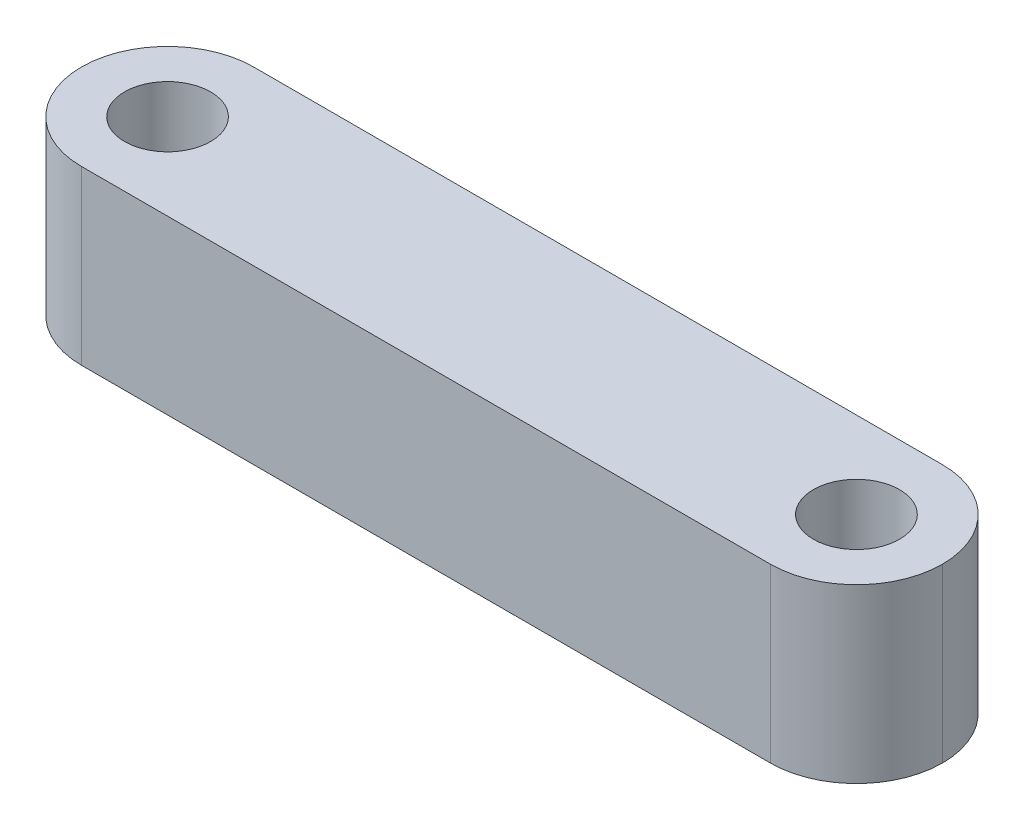
ISO-10303-21;
HEADER;
FILE_DESCRIPTION(('STEP AP214'),'2;1');
FILE_NAME('part.step','',(''),(''),'','','');
FILE_SCHEMA(('AUTOMOTIVE_DESIGN { 1 0 10303 214 1 1 1 1 }'));
ENDSEC;
DATA;
#1=APPLICATION_CONTEXT('core data for automotive mechanical design processes');
#2=APPLICATION_PROTOCOL_DEFINITION('international standard','automotive_design',2000,#1);
#3=PRODUCT_CONTEXT('',#1,'mechanical');
#4=PRODUCT('Part','Part','',(#3));
#5=PRODUCT_RELATED_PRODUCT_CATEGORY('part','',(#4));
#6=PRODUCT_DEFINITION_FORMATION('','',#4);
#7=PRODUCT_DEFINITION_CONTEXT('part definition',#1,'design');
#8=PRODUCT_DEFINITION('design','',#6,#7);
#9=PRODUCT_DEFINITION_SHAPE('','',#8);
#10=(LENGTH_UNIT() NAMED_UNIT(*) SI_UNIT(.MILLI.,.METRE.));
#11=(NAMED_UNIT(*) PLANE_ANGLE_UNIT() SI_UNIT($,.RADIAN.));
#12=(NAMED_UNIT(*) SI_UNIT($,.STERADIAN.) SOLID_ANGLE_UNIT());
#13=UNCERTAINTY_MEASURE_WITH_UNIT(LENGTH_MEASURE(1.E-05),#10,'distance_accuracy_value','');
#14=(GEOMETRIC_REPRESENTATION_CONTEXT(3) GLOBAL_UNCERTAINTY_ASSIGNED_CONTEXT((#13)) GLOBAL_UNIT_ASSIGNED_CONTEXT((#10,
#11,#12)) REPRESENTATION_CONTEXT('',''));
#15=CARTESIAN_POINT('',(0.,0.,0.));
#16=DIRECTION('',(0.,0.,1.));
#17=DIRECTION('',(1.,0.,0.));
#18=AXIS2_PLACEMENT_3D('',#15,#16,#17);
#19=CARTESIAN_POINT('',(-12.5,5.,-2.5));
#20=DIRECTION('',(0.,0.,1.));
#21=DIRECTION('',(1.,0.,0.));
#22=AXIS2_PLACEMENT_3D('',#19,#20,#21);
#23=PLANE('',#22);
#24=DIRECTION('',(-1.,0.,0.));
#25=VECTOR('',#24,1.);
#26=CARTESIAN_POINT('',(-12.5,5.,-2.5));
#27=LINE('',#26,#25);
#28=CARTESIAN_POINT('',(10.,5.,-2.5));
#29=VERTEX_POINT('',#28);
#30=CARTESIAN_POINT('',(-10.,5.,-2.5));
#31=VERTEX_POINT('',#30);
#32=EDGE_CURVE('E132',#29,#31,#27,.T.);
#33=ORIENTED_EDGE('',*,*,#32,.F.);
#34=DIRECTION('',(0.,-1.,0.));
#35=VECTOR('',#34,1.);
#36=CARTESIAN_POINT('',(10.,5.,-2.5));
#37=LINE('',#36,#35);
#38=CARTESIAN_POINT('',(10.,0.,-2.5));
#39=VERTEX_POINT('',#38);
#40=EDGE_CURVE('E11',#29,#39,#37,.T.);
#41=ORIENTED_EDGE('',*,*,#40,.T.);
#42=DIRECTION('',(-1.,0.,0.));
#43=VECTOR('',#42,1.);
#44=CARTESIAN_POINT('',(-12.5,0.,-2.5));
#45=LINE('',#44,#43);
#46=CARTESIAN_POINT('',(-10.,0.,-2.5));
#47=VERTEX_POINT('',#46);
#48=EDGE_CURVE('E95',#39,#47,#45,.T.);
#49=ORIENTED_EDGE('',*,*,#48,.T.);
#50=DIRECTION('',(0.,-1.,0.));
#51=VECTOR('',#50,1.);
#52=CARTESIAN_POINT('',(-10.,5.,-2.5));
#53=LINE('',#52,#51);
#54=EDGE_CURVE('E42',#47,#31,#53,.F.);
#55=ORIENTED_EDGE('',*,*,#54,.T.);
#56=EDGE_LOOP('',(#33,#41,#49,#55));
#57=FACE_BOUND('',#56,.T.);
#58=ADVANCED_FACE('F33',(#57),#23,.F.);
#59=CARTESIAN_POINT('',(-12.5,5.,2.5));
#60=DIRECTION('',(0.,0.,-1.));
#61=DIRECTION('',(-1.,0.,0.));
#62=AXIS2_PLACEMENT_3D('',#59,#60,#61);
#63=PLANE('',#62);
#64=DIRECTION('',(1.,0.,0.));
#65=VECTOR('',#64,1.);
#66=CARTESIAN_POINT('',(-12.5,0.,2.5));
#67=LINE('',#66,#65);
#68=CARTESIAN_POINT('',(-10.,0.,2.5));
#69=VERTEX_POINT('',#68);
#70=CARTESIAN_POINT('',(10.,0.,2.5));
#71=VERTEX_POINT('',#70);
#72=EDGE_CURVE('E131',#69,#71,#67,.T.);
#73=ORIENTED_EDGE('',*,*,#72,.T.);
#74=DIRECTION('',(0.,-1.,0.));
#75=VECTOR('',#74,1.);
#76=CARTESIAN_POINT('',(10.,5.,2.5));
#77=LINE('',#76,#75);
#78=CARTESIAN_POINT('',(10.,5.,2.5));
#79=VERTEX_POINT('',#78);
#80=EDGE_CURVE('E110',#71,#79,#77,.F.);
#81=ORIENTED_EDGE('',*,*,#80,.T.);
#82=DIRECTION('',(1.,0.,0.));
#83=VECTOR('',#82,1.);
#84=CARTESIAN_POINT('',(-12.5,5.,2.5));
#85=LINE('',#84,#83);
#86=CARTESIAN_POINT('',(-10.,5.,2.5));
#87=VERTEX_POINT('',#86);
#88=EDGE_CURVE('E127',#87,#79,#85,.T.);
#89=ORIENTED_EDGE('',*,*,#88,.F.);
#90=DIRECTION('',(0.,-1.,0.));
#91=VECTOR('',#90,1.);
#92=CARTESIAN_POINT('',(-10.,5.,2.5));
#93=LINE('',#92,#91);
#94=EDGE_CURVE('E111',#87,#69,#93,.T.);
#95=ORIENTED_EDGE('',*,*,#94,.T.);
#96=EDGE_LOOP('',(#73,#81,#89,#95));
#97=FACE_BOUND('',#96,.T.);
#98=ADVANCED_FACE('F129',(#97),#63,.F.);
#99=CARTESIAN_POINT('',(0.,5.,0.));
#100=DIRECTION('',(0.,-1.,0.));
#101=DIRECTION('',(0.,0.,-1.));
#102=AXIS2_PLACEMENT_3D('',#99,#100,#101);
#103=PLANE('',#102);
#104=CARTESIAN_POINT('',(-10.,5.,0.));
#105=DIRECTION('',(0.,1.,0.));
#106=DIRECTION('',(0.,0.,1.));
#107=AXIS2_PLACEMENT_3D('',#104,#105,#106);
#108=CIRCLE('',#107,1.25);
#109=CARTESIAN_POINT('',(-10.,5.,1.25));
#110=VERTEX_POINT('',#109);
#111=EDGE_CURVE('E187',#110,#110,#108,.T.);
#112=ORIENTED_EDGE('',*,*,#111,.F.);
#113=EDGE_LOOP('',(#112));
#114=FACE_BOUND('',#113,.T.);
#115=CARTESIAN_POINT('',(10.,5.,0.));
#116=DIRECTION('',(0.,1.,0.));
#117=DIRECTION('',(0.,0.,1.));
#118=AXIS2_PLACEMENT_3D('',#115,#116,#117);
#119=CIRCLE('',#118,1.25);
#120=CARTESIAN_POINT('',(10.,5.,1.25));
#121=VERTEX_POINT('',#120);
#122=EDGE_CURVE('E106',#121,#121,#119,.T.);
#123=ORIENTED_EDGE('',*,*,#122,.F.);
#124=EDGE_LOOP('',(#123));
#125=FACE_BOUND('',#124,.T.);
#126=ORIENTED_EDGE('',*,*,#88,.T.);
#127=CARTESIAN_POINT('',(10.,5.,0.));
#128=DIRECTION('',(0.,-1.,0.));
#129=DIRECTION('',(0.,0.,-1.));
#130=AXIS2_PLACEMENT_3D('',#127,#128,#129);
#131=CIRCLE('',#130,2.5);
#132=CARTESIAN_POINT('',(12.5,5.,0.));
#133=VERTEX_POINT('',#132);
#134=EDGE_CURVE('E122',#79,#133,#131,.F.);
#135=ORIENTED_EDGE('',*,*,#134,.T.);
#136=CARTESIAN_POINT('',(10.,5.,0.));
#137=DIRECTION('',(0.,-1.,0.));
#138=DIRECTION('',(0.,0.,-1.));
#139=AXIS2_PLACEMENT_3D('',#136,#137,#138);
#140=CIRCLE('',#139,2.5);
#141=EDGE_CURVE('E104',#133,#29,#140,.F.);
#142=ORIENTED_EDGE('',*,*,#141,.T.);
#143=ORIENTED_EDGE('',*,*,#32,.T.);
#144=CARTESIAN_POINT('',(-10.,5.,0.));
#145=DIRECTION('',(0.,-1.,0.));
#146=DIRECTION('',(0.,0.,-1.));
#147=AXIS2_PLACEMENT_3D('',#144,#145,#146);
#148=CIRCLE('',#147,2.5);
#149=CARTESIAN_POINT('',(-12.5,5.,0.));
#150=VERTEX_POINT('',#149);
#151=EDGE_CURVE('E50',#31,#150,#148,.F.);
#152=ORIENTED_EDGE('',*,*,#151,.T.);
#153=CARTESIAN_POINT('',(-10.,5.,0.));
#154=DIRECTION('',(0.,-1.,0.));
#155=DIRECTION('',(0.,0.,-1.));
#156=AXIS2_PLACEMENT_3D('',#153,#154,#155);
#157=CIRCLE('',#156,2.5);
#158=EDGE_CURVE('E119',#150,#87,#157,.F.);
#159=ORIENTED_EDGE('',*,*,#158,.T.);
#160=EDGE_LOOP('',(#126,#135,#142,#143,#152,#159));
#161=FACE_BOUND('',#160,.T.);
#162=ADVANCED_FACE('F125',(#114,#125,#161),#103,.F.);
#163=CARTESIAN_POINT('',(0.,0.,0.));
#164=DIRECTION('',(0.,-1.,0.));
#165=DIRECTION('',(0.,0.,-1.));
#166=AXIS2_PLACEMENT_3D('',#163,#164,#165);
#167=PLANE('',#166);
#168=CARTESIAN_POINT('',(-10.,0.,0.));
#169=DIRECTION('',(0.,1.,0.));
#170=DIRECTION('',(0.,0.,1.));
#171=AXIS2_PLACEMENT_3D('',#168,#169,#170);
#172=CIRCLE('',#171,1.25);
#173=CARTESIAN_POINT('',(-10.,0.,1.25));
#174=VERTEX_POINT('',#173);
#175=EDGE_CURVE('E135',#174,#174,#172,.T.);
#176=ORIENTED_EDGE('',*,*,#175,.T.);
#177=EDGE_LOOP('',(#176));
#178=FACE_BOUND('',#177,.T.);
#179=CARTESIAN_POINT('',(10.,0.,0.));
#180=DIRECTION('',(0.,1.,0.));
#181=DIRECTION('',(0.,0.,1.));
#182=AXIS2_PLACEMENT_3D('',#179,#180,#181);
#183=CIRCLE('',#182,1.25);
#184=CARTESIAN_POINT('',(10.,0.,1.25));
#185=VERTEX_POINT('',#184);
#186=EDGE_CURVE('E186',#185,#185,#183,.T.);
#187=ORIENTED_EDGE('',*,*,#186,.T.);
#188=EDGE_LOOP('',(#187));
#189=FACE_BOUND('',#188,.T.);
#190=CARTESIAN_POINT('',(10.,0.,0.));
#191=DIRECTION('',(0.,-1.,0.));
#192=DIRECTION('',(0.,0.,-1.));
#193=AXIS2_PLACEMENT_3D('',#190,#191,#192);
#194=CIRCLE('',#193,2.5);
#195=CARTESIAN_POINT('',(12.5,0.,0.));
#196=VERTEX_POINT('',#195);
#197=EDGE_CURVE('E88',#39,#196,#194,.T.);
#198=ORIENTED_EDGE('',*,*,#197,.T.);
#199=CARTESIAN_POINT('',(10.,0.,0.));
#200=DIRECTION('',(0.,-1.,0.));
#201=DIRECTION('',(0.,0.,-1.));
#202=AXIS2_PLACEMENT_3D('',#199,#200,#201);
#203=CIRCLE('',#202,2.5);
#204=EDGE_CURVE('E93',#196,#71,#203,.T.);
#205=ORIENTED_EDGE('',*,*,#204,.T.);
#206=ORIENTED_EDGE('',*,*,#72,.F.);
#207=CARTESIAN_POINT('',(-10.,0.,0.));
#208=DIRECTION('',(0.,-1.,0.));
#209=DIRECTION('',(0.,0.,-1.));
#210=AXIS2_PLACEMENT_3D('',#207,#208,#209);
#211=CIRCLE('',#210,2.5);
#212=CARTESIAN_POINT('',(-12.5,0.,0.));
#213=VERTEX_POINT('',#212);
#214=EDGE_CURVE('E98',#69,#213,#211,.T.);
#215=ORIENTED_EDGE('',*,*,#214,.T.);
#216=CARTESIAN_POINT('',(-10.,0.,0.));
#217=DIRECTION('',(0.,-1.,0.));
#218=DIRECTION('',(0.,0.,-1.));
#219=AXIS2_PLACEMENT_3D('',#216,#217,#218);
#220=CIRCLE('',#219,2.5);
#221=EDGE_CURVE('E139',#213,#47,#220,.T.);
#222=ORIENTED_EDGE('',*,*,#221,.T.);
#223=ORIENTED_EDGE('',*,*,#48,.F.);
#224=EDGE_LOOP('',(#198,#205,#206,#215,#222,#223));
#225=FACE_BOUND('',#224,.T.);
#226=ADVANCED_FACE('F90',(#178,#189,#225),#167,.T.);
#227=CARTESIAN_POINT('',(10.,0.,0.));
#228=DIRECTION('',(0.,1.,0.));
#229=DIRECTION('',(0.,0.,1.));
#230=AXIS2_PLACEMENT_3D('',#227,#228,#229);
#231=CYLINDRICAL_SURFACE('',#230,1.25);
#232=ORIENTED_EDGE('',*,*,#186,.F.);
#233=EDGE_LOOP('',(#232));
#234=FACE_BOUND('',#233,.T.);
#235=ORIENTED_EDGE('',*,*,#122,.T.);
#236=EDGE_LOOP('',(#235));
#237=FACE_BOUND('',#236,.T.);
#238=ADVANCED_FACE('F165',(#234,#237),#231,.F.);
#239=CARTESIAN_POINT('',(-10.,0.,0.));
#240=DIRECTION('',(0.,1.,0.));
#241=DIRECTION('',(0.,0.,1.));
#242=AXIS2_PLACEMENT_3D('',#239,#240,#241);
#243=CYLINDRICAL_SURFACE('',#242,1.25);
#244=ORIENTED_EDGE('',*,*,#175,.F.);
#245=EDGE_LOOP('',(#244));
#246=FACE_BOUND('',#245,.T.);
#247=ORIENTED_EDGE('',*,*,#111,.T.);
#248=EDGE_LOOP('',(#247));
#249=FACE_BOUND('',#248,.T.);
#250=ADVANCED_FACE('F161',(#246,#249),#243,.F.);
#251=CARTESIAN_POINT('',(10.,5.,0.));
#252=DIRECTION('',(0.,-1.,0.));
#253=DIRECTION('',(0.,0.,-1.));
#254=AXIS2_PLACEMENT_3D('',#251,#252,#253);
#255=CYLINDRICAL_SURFACE('',#254,2.5);
#256=ORIENTED_EDGE('',*,*,#40,.F.);
#257=ORIENTED_EDGE('',*,*,#141,.F.);
#258=DIRECTION('',(0.,-1.,0.));
#259=VECTOR('',#258,1.);
#260=CARTESIAN_POINT('',(12.5,5.,0.));
#261=LINE('',#260,#259);
#262=EDGE_CURVE('E102',#196,#133,#261,.F.);
#263=ORIENTED_EDGE('',*,*,#262,.F.);
#264=ORIENTED_EDGE('',*,*,#197,.F.);
#265=EDGE_LOOP('',(#256,#257,#263,#264));
#266=FACE_BOUND('',#265,.T.);
#267=ADVANCED_FACE('F103',(#266),#255,.T.);
#268=CARTESIAN_POINT('',(10.,5.,0.));
#269=DIRECTION('',(0.,-1.,0.));
#270=DIRECTION('',(0.,0.,-1.));
#271=AXIS2_PLACEMENT_3D('',#268,#269,#270);
#272=CYLINDRICAL_SURFACE('',#271,2.5);
#273=ORIENTED_EDGE('',*,*,#134,.F.);
#274=ORIENTED_EDGE('',*,*,#80,.F.);
#275=ORIENTED_EDGE('',*,*,#204,.F.);
#276=ORIENTED_EDGE('',*,*,#262,.T.);
#277=EDGE_LOOP('',(#273,#274,#275,#276));
#278=FACE_BOUND('',#277,.T.);
#279=ADVANCED_FACE('F108',(#278),#272,.T.);
#280=CARTESIAN_POINT('',(-10.,5.,0.));
#281=DIRECTION('',(0.,-1.,0.));
#282=DIRECTION('',(0.,0.,-1.));
#283=AXIS2_PLACEMENT_3D('',#280,#281,#282);
#284=CYLINDRICAL_SURFACE('',#283,2.5);
#285=DIRECTION('',(0.,-1.,0.));
#286=VECTOR('',#285,1.);
#287=CARTESIAN_POINT('',(-12.5,5.,0.));
#288=LINE('',#287,#286);
#289=EDGE_CURVE('E37',#150,#213,#288,.T.);
#290=ORIENTED_EDGE('',*,*,#289,.F.);
#291=ORIENTED_EDGE('',*,*,#151,.F.);
#292=ORIENTED_EDGE('',*,*,#54,.F.);
#293=ORIENTED_EDGE('',*,*,#221,.F.);
#294=EDGE_LOOP('',(#290,#291,#292,#293));
#295=FACE_BOUND('',#294,.T.);
#296=ADVANCED_FACE('F35',(#295),#284,.T.);
#297=CARTESIAN_POINT('',(-10.,5.,0.));
#298=DIRECTION('',(0.,-1.,0.));
#299=DIRECTION('',(0.,0.,-1.));
#300=AXIS2_PLACEMENT_3D('',#297,#298,#299);
#301=CYLINDRICAL_SURFACE('',#300,2.5);
#302=ORIENTED_EDGE('',*,*,#158,.F.);
#303=ORIENTED_EDGE('',*,*,#289,.T.);
#304=ORIENTED_EDGE('',*,*,#214,.F.);
#305=ORIENTED_EDGE('',*,*,#94,.F.);
#306=EDGE_LOOP('',(#302,#303,#304,#305));
#307=FACE_BOUND('',#306,.T.);
#308=ADVANCED_FACE('F145',(#307),#301,.T.);
#309=CLOSED_SHELL('',(#58,#98,#162,#226,#238,#250,#267,#279,#296,#308));
#310=MANIFOLD_SOLID_BREP('B2',#309);
#311=ADVANCED_BREP_SHAPE_REPRESENTATION('',(#18,#310),#14);
#312=SHAPE_DEFINITION_REPRESENTATION(#9,#311);
ENDSEC;
END-ISO-10303-21;
